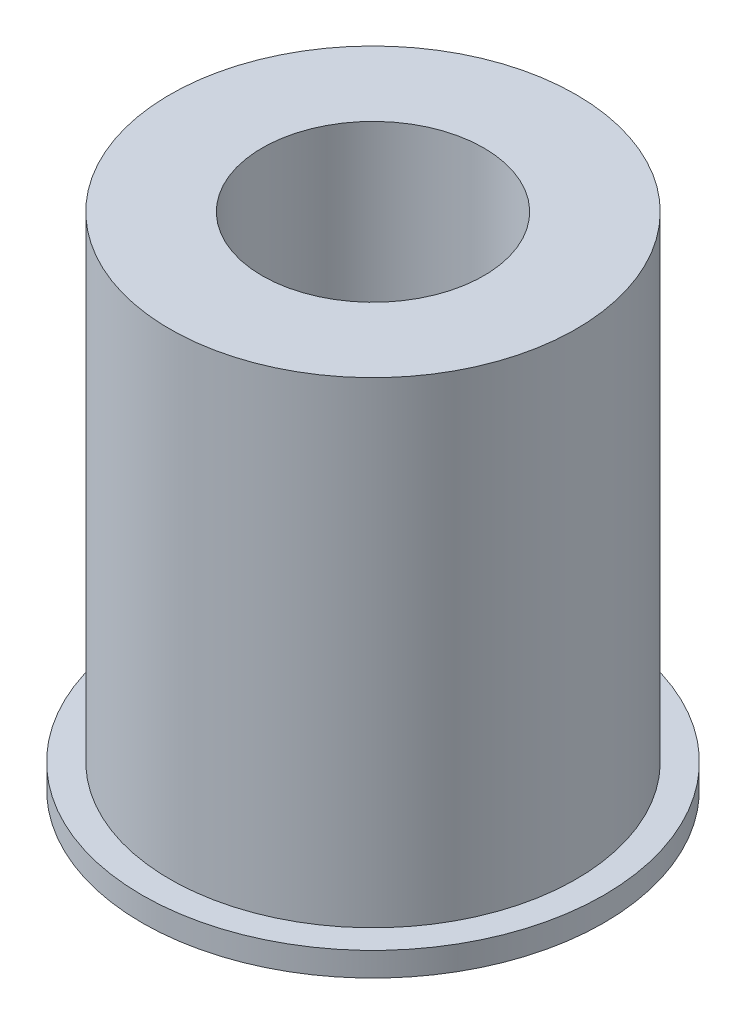
ISO-10303-21;
HEADER;
FILE_DESCRIPTION(('STEP AP214'),'2;1');
FILE_NAME('part.step','',(''),(''),'','','');
FILE_SCHEMA(('AUTOMOTIVE_DESIGN { 1 0 10303 214 1 1 1 1 }'));
ENDSEC;
DATA;
#1=APPLICATION_CONTEXT('core data for automotive mechanical design processes');
#2=APPLICATION_PROTOCOL_DEFINITION('international standard','automotive_design',2000,#1);
#3=PRODUCT_CONTEXT('',#1,'mechanical');
#4=PRODUCT('Part','Part','',(#3));
#5=PRODUCT_RELATED_PRODUCT_CATEGORY('part','',(#4));
#6=PRODUCT_DEFINITION_FORMATION('','',#4);
#7=PRODUCT_DEFINITION_CONTEXT('part definition',#1,'design');
#8=PRODUCT_DEFINITION('design','',#6,#7);
#9=PRODUCT_DEFINITION_SHAPE('','',#8);
#10=(LENGTH_UNIT() NAMED_UNIT(*) SI_UNIT(.MILLI.,.METRE.));
#11=(NAMED_UNIT(*) PLANE_ANGLE_UNIT() SI_UNIT($,.RADIAN.));
#12=(NAMED_UNIT(*) SI_UNIT($,.STERADIAN.) SOLID_ANGLE_UNIT());
#13=UNCERTAINTY_MEASURE_WITH_UNIT(LENGTH_MEASURE(1.E-05),#10,'distance_accuracy_value','');
#14=(GEOMETRIC_REPRESENTATION_CONTEXT(3) GLOBAL_UNCERTAINTY_ASSIGNED_CONTEXT((#13)) GLOBAL_UNIT_ASSIGNED_CONTEXT((#10,
#11,#12)) REPRESENTATION_CONTEXT('',''));
#15=CARTESIAN_POINT('',(0.,0.,0.));
#16=DIRECTION('',(0.,0.,1.));
#17=DIRECTION('',(1.,0.,0.));
#18=AXIS2_PLACEMENT_3D('',#15,#16,#17);
#19=CARTESIAN_POINT('',(0.,27.1,0.));
#20=DIRECTION('',(0.,-1.,0.));
#21=DIRECTION('',(0.,0.,-1.));
#22=AXIS2_PLACEMENT_3D('',#19,#20,#21);
#23=CYLINDRICAL_SURFACE('',#22,11.);
#24=CARTESIAN_POINT('',(0.,1.3,0.));
#25=DIRECTION('',(0.,1.,0.));
#26=DIRECTION('',(0.,0.,1.));
#27=AXIS2_PLACEMENT_3D('',#24,#25,#26);
#28=CIRCLE('',#27,11.);
#29=CARTESIAN_POINT('',(0.,1.3,-11.));
#30=VERTEX_POINT('',#29);
#31=EDGE_CURVE('E43',#30,#30,#28,.T.);
#32=CARTESIAN_POINT('',(0.,27.1,0.));
#33=DIRECTION('',(0.,1.,0.));
#34=DIRECTION('',(0.,0.,1.));
#35=AXIS2_PLACEMENT_3D('',#32,#33,#34);
#36=CIRCLE('',#35,11.);
#37=CARTESIAN_POINT('',(0.,27.1,-11.));
#38=VERTEX_POINT('',#37);
#39=EDGE_CURVE('E10',#38,#38,#36,.T.);
#40=CARTESIAN_POINT('',(0.,1.3,-11.));
#41=CARTESIAN_POINT('',(0.,1.56875,-11.));
#42=CARTESIAN_POINT('',(0.,1.8375,-11.));
#43=CARTESIAN_POINT('',(0.,2.375,-11.));
#44=CARTESIAN_POINT('',(0.,2.64375,-11.));
#45=CARTESIAN_POINT('',(0.,3.18125,-11.));
#46=CARTESIAN_POINT('',(0.,3.45,-11.));
#47=CARTESIAN_POINT('',(0.,3.9875,-11.));
#48=CARTESIAN_POINT('',(0.,4.25625,-11.));
#49=CARTESIAN_POINT('',(0.,4.79375,-11.));
#50=CARTESIAN_POINT('',(0.,5.0625,-11.));
#51=CARTESIAN_POINT('',(0.,5.6,-11.));
#52=CARTESIAN_POINT('',(0.,5.86875,-11.));
#53=CARTESIAN_POINT('',(0.,6.40625,-11.));
#54=CARTESIAN_POINT('',(0.,6.675,-11.));
#55=CARTESIAN_POINT('',(0.,7.2125,-11.));
#56=CARTESIAN_POINT('',(0.,7.48125,-11.));
#57=CARTESIAN_POINT('',(0.,8.01875,-11.));
#58=CARTESIAN_POINT('',(0.,8.2875,-11.));
#59=CARTESIAN_POINT('',(0.,8.825,-11.));
#60=CARTESIAN_POINT('',(0.,9.09375,-11.));
#61=CARTESIAN_POINT('',(0.,9.63125,-11.));
#62=CARTESIAN_POINT('',(0.,9.9,-11.));
#63=CARTESIAN_POINT('',(0.,10.4375,-11.));
#64=CARTESIAN_POINT('',(0.,10.70625,-11.));
#65=CARTESIAN_POINT('',(0.,11.24375,-11.));
#66=CARTESIAN_POINT('',(0.,11.5125,-11.));
#67=CARTESIAN_POINT('',(0.,12.05,-11.));
#68=CARTESIAN_POINT('',(0.,12.31875,-11.));
#69=CARTESIAN_POINT('',(0.,12.85625,-11.));
#70=CARTESIAN_POINT('',(0.,13.125,-11.));
#71=CARTESIAN_POINT('',(0.,13.6625,-11.));
#72=CARTESIAN_POINT('',(0.,13.93125,-11.));
#73=CARTESIAN_POINT('',(0.,14.46875,-11.));
#74=CARTESIAN_POINT('',(0.,14.7375,-11.));
#75=CARTESIAN_POINT('',(0.,15.275,-11.));
#76=CARTESIAN_POINT('',(0.,15.54375,-11.));
#77=CARTESIAN_POINT('',(0.,16.08125,-11.));
#78=CARTESIAN_POINT('',(0.,16.35,-11.));
#79=CARTESIAN_POINT('',(0.,16.8875,-11.));
#80=CARTESIAN_POINT('',(0.,17.15625,-11.));
#81=CARTESIAN_POINT('',(0.,17.69375,-11.));
#82=CARTESIAN_POINT('',(0.,17.9625,-11.));
#83=CARTESIAN_POINT('',(0.,18.5,-11.));
#84=CARTESIAN_POINT('',(0.,18.76875,-11.));
#85=CARTESIAN_POINT('',(0.,19.30625,-11.));
#86=CARTESIAN_POINT('',(0.,19.575,-11.));
#87=CARTESIAN_POINT('',(0.,20.1125,-11.));
#88=CARTESIAN_POINT('',(0.,20.38125,-11.));
#89=CARTESIAN_POINT('',(0.,20.91875,-11.));
#90=CARTESIAN_POINT('',(0.,21.1875,-11.));
#91=CARTESIAN_POINT('',(0.,21.725,-11.));
#92=CARTESIAN_POINT('',(0.,21.99375,-11.));
#93=CARTESIAN_POINT('',(0.,22.53125,-11.));
#94=CARTESIAN_POINT('',(0.,22.8,-11.));
#95=CARTESIAN_POINT('',(0.,23.3375,-11.));
#96=CARTESIAN_POINT('',(0.,23.60625,-11.));
#97=CARTESIAN_POINT('',(0.,24.14375,-11.));
#98=CARTESIAN_POINT('',(0.,24.4125,-11.));
#99=CARTESIAN_POINT('',(0.,24.95,-11.));
#100=CARTESIAN_POINT('',(0.,25.21875,-11.));
#101=CARTESIAN_POINT('',(0.,25.75625,-11.));
#102=CARTESIAN_POINT('',(0.,26.025,-11.));
#103=CARTESIAN_POINT('',(0.,26.5625,-11.));
#104=CARTESIAN_POINT('',(0.,26.83125,-11.));
#105=CARTESIAN_POINT('',(0.,27.1,-11.));
#106=B_SPLINE_CURVE_WITH_KNOTS('',3,(#40,#41,#42,#43,#44,#45,#46,#47,#48,#49,#50,#51,#52,#53,
#54,#55,#56,#57,#58,#59,#60,#61,#62,#63,#64,#65,#66,#67,#68,#69,#70,#71,#72,#73,#74,#75,#76,#77,
#78,#79,#80,#81,#82,#83,#84,#85,#86,#87,#88,#89,#90,#91,#92,#93,#94,#95,#96,#97,#98,#99,#100,
#101,#102,#103,#104,#105),.UNSPECIFIED.,.F.,.F.,(4,2,2,2,2,2,2,2,2,2,2,2,2,2,2,2,2,2,2,2,2,2,2,
2,2,2,2,2,2,2,2,2,4),(0.,0.806250000000001,1.6125,2.41875,3.225,4.03125,4.8375,5.64375,6.45,
7.25625,8.0625,8.86875,9.675,10.48125,11.2875,12.09375,12.9,13.70625,14.5125,15.31875,16.125,
16.93125,17.7375,18.54375,19.35,20.15625,20.9625,21.76875,22.575,23.38125,24.1875,24.99375,
25.8),.UNSPECIFIED.);
#107=EDGE_CURVE('BSEAM40',#30,#38,#106,.T.);
#108=ORIENTED_EDGE('',*,*,#31,.T.);
#109=ORIENTED_EDGE('',*,*,#39,.F.);
#110=ORIENTED_EDGE('',*,*,#107,.T.);
#111=ORIENTED_EDGE('',*,*,#107,.F.);
#112=EDGE_LOOP('',(#108,#110,#109,#111));
#113=FACE_BOUND('',#112,.T.);
#114=ADVANCED_FACE('F40',(#113),#23,.T.);
#115=CARTESIAN_POINT('',(0.,27.1,0.));
#116=DIRECTION('',(0.,1.,0.));
#117=DIRECTION('',(0.,0.,1.));
#118=AXIS2_PLACEMENT_3D('',#115,#116,#117);
#119=PLANE('',#118);
#120=CARTESIAN_POINT('',(0.,27.1,0.));
#121=DIRECTION('',(0.,1.,0.));
#122=DIRECTION('',(0.,0.,1.));
#123=AXIS2_PLACEMENT_3D('',#120,#121,#122);
#124=CIRCLE('',#123,6.);
#125=CARTESIAN_POINT('',(0.,27.1,6.));
#126=VERTEX_POINT('',#125);
#127=EDGE_CURVE('E58',#126,#126,#124,.F.);
#128=ORIENTED_EDGE('',*,*,#127,.T.);
#129=EDGE_LOOP('',(#128));
#130=FACE_BOUND('',#129,.T.);
#131=ORIENTED_EDGE('',*,*,#39,.T.);
#132=EDGE_LOOP('',(#131));
#133=FACE_BOUND('',#132,.T.);
#134=ADVANCED_FACE('F84',(#130,#133),#119,.T.);
#135=CARTESIAN_POINT('',(0.,1.3,0.));
#136=DIRECTION('',(0.,-1.,0.));
#137=DIRECTION('',(0.,0.,-1.));
#138=AXIS2_PLACEMENT_3D('',#135,#136,#137);
#139=CYLINDRICAL_SURFACE('',#138,12.5);
#140=CARTESIAN_POINT('',(0.,1.3,0.));
#141=DIRECTION('',(0.,1.,0.));
#142=DIRECTION('',(0.,0.,1.));
#143=AXIS2_PLACEMENT_3D('',#140,#141,#142);
#144=CIRCLE('',#143,12.5);
#145=CARTESIAN_POINT('',(0.,1.3,12.5));
#146=VERTEX_POINT('',#145);
#147=EDGE_CURVE('E52',#146,#146,#144,.T.);
#148=ORIENTED_EDGE('',*,*,#147,.F.);
#149=EDGE_LOOP('',(#148));
#150=FACE_BOUND('',#149,.T.);
#151=CARTESIAN_POINT('',(0.,0.,0.));
#152=DIRECTION('',(0.,1.,0.));
#153=DIRECTION('',(0.,0.,1.));
#154=AXIS2_PLACEMENT_3D('',#151,#152,#153);
#155=CIRCLE('',#154,12.5);
#156=CARTESIAN_POINT('',(0.,0.,12.5));
#157=VERTEX_POINT('',#156);
#158=EDGE_CURVE('E54',#157,#157,#155,.T.);
#159=ORIENTED_EDGE('',*,*,#158,.T.);
#160=EDGE_LOOP('',(#159));
#161=FACE_BOUND('',#160,.T.);
#162=ADVANCED_FACE('F89',(#150,#161),#139,.T.);
#163=CARTESIAN_POINT('',(0.,1.3,0.));
#164=DIRECTION('',(0.,1.,0.));
#165=DIRECTION('',(0.,0.,1.));
#166=AXIS2_PLACEMENT_3D('',#163,#164,#165);
#167=PLANE('',#166);
#168=ORIENTED_EDGE('',*,*,#31,.F.);
#169=EDGE_LOOP('',(#168));
#170=FACE_BOUND('',#169,.T.);
#171=ORIENTED_EDGE('',*,*,#147,.T.);
#172=EDGE_LOOP('',(#171));
#173=FACE_BOUND('',#172,.T.);
#174=ADVANCED_FACE('F80',(#170,#173),#167,.T.);
#175=CARTESIAN_POINT('',(0.,0.,0.));
#176=DIRECTION('',(0.,1.,0.));
#177=DIRECTION('',(0.,0.,1.));
#178=AXIS2_PLACEMENT_3D('',#175,#176,#177);
#179=PLANE('',#178);
#180=CARTESIAN_POINT('',(0.,0.,0.));
#181=DIRECTION('',(0.,1.,0.));
#182=DIRECTION('',(0.,0.,1.));
#183=AXIS2_PLACEMENT_3D('',#180,#181,#182);
#184=CIRCLE('',#183,6.);
#185=CARTESIAN_POINT('',(0.,0.,6.));
#186=VERTEX_POINT('',#185);
#187=EDGE_CURVE('E65',#186,#186,#184,.T.);
#188=ORIENTED_EDGE('',*,*,#187,.T.);
#189=EDGE_LOOP('',(#188));
#190=FACE_BOUND('',#189,.T.);
#191=ORIENTED_EDGE('',*,*,#158,.F.);
#192=EDGE_LOOP('',(#191));
#193=FACE_BOUND('',#192,.T.);
#194=ADVANCED_FACE('F70',(#190,#193),#179,.F.);
#195=CARTESIAN_POINT('',(0.,29.3,0.));
#196=DIRECTION('',(0.,-1.,0.));
#197=DIRECTION('',(0.,0.,-1.));
#198=AXIS2_PLACEMENT_3D('',#195,#196,#197);
#199=CYLINDRICAL_SURFACE('',#198,6.);
#200=ORIENTED_EDGE('',*,*,#127,.F.);
#201=EDGE_LOOP('',(#200));
#202=FACE_BOUND('',#201,.T.);
#203=ORIENTED_EDGE('',*,*,#187,.F.);
#204=EDGE_LOOP('',(#203));
#205=FACE_BOUND('',#204,.T.);
#206=ADVANCED_FACE('F73',(#202,#205),#199,.F.);
#207=CLOSED_SHELL('',(#114,#134,#162,#174,#194,#206));
#208=MANIFOLD_SOLID_BREP('B2',#207);
#209=ADVANCED_BREP_SHAPE_REPRESENTATION('',(#18,#208),#14);
#210=SHAPE_DEFINITION_REPRESENTATION(#9,#209);
ENDSEC;
END-ISO-10303-21;
